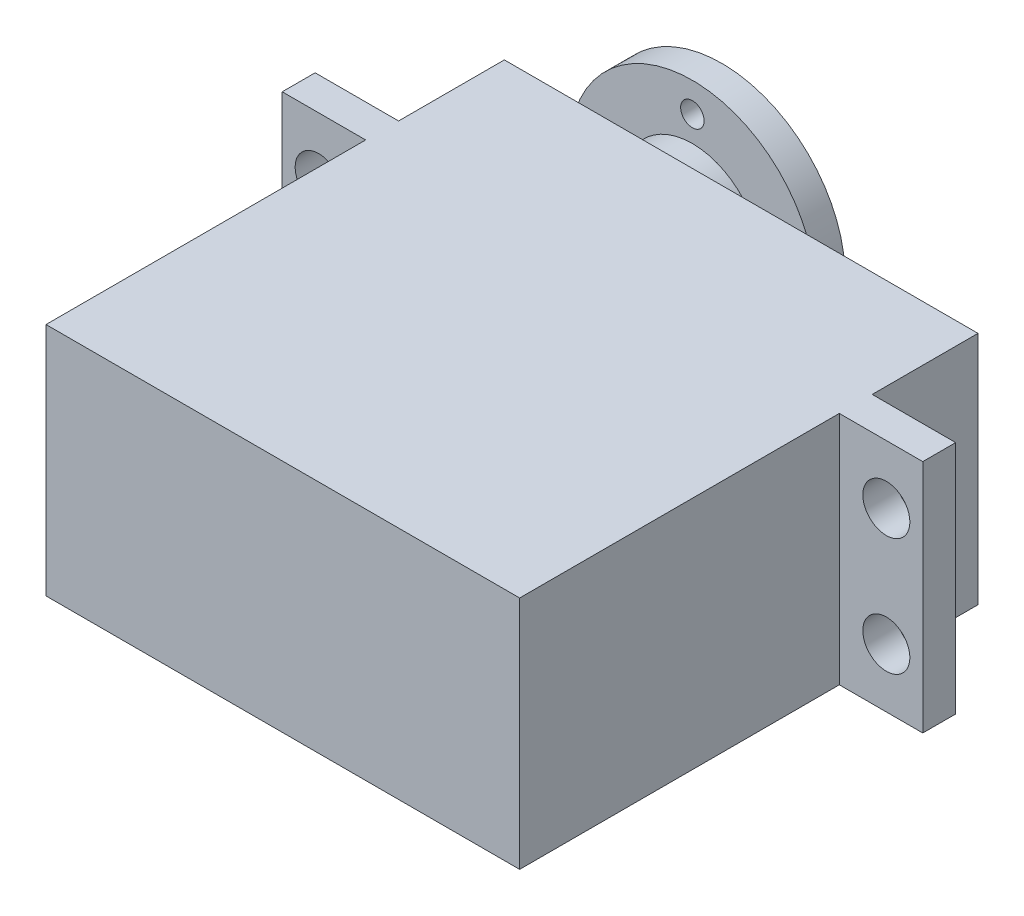
ISO-10303-21;
HEADER;
FILE_DESCRIPTION(('STEP AP214'),'2;1');
FILE_NAME('part.step','',(''),(''),'','','');
FILE_SCHEMA(('AUTOMOTIVE_DESIGN { 1 0 10303 214 1 1 1 1 }'));
ENDSEC;
DATA;
#1=APPLICATION_CONTEXT('core data for automotive mechanical design processes');
#2=APPLICATION_PROTOCOL_DEFINITION('international standard','automotive_design',2000,#1);
#3=PRODUCT_CONTEXT('',#1,'mechanical');
#4=PRODUCT('Part','Part','',(#3));
#5=PRODUCT_RELATED_PRODUCT_CATEGORY('part','',(#4));
#6=PRODUCT_DEFINITION_FORMATION('','',#4);
#7=PRODUCT_DEFINITION_CONTEXT('part definition',#1,'design');
#8=PRODUCT_DEFINITION('design','',#6,#7);
#9=PRODUCT_DEFINITION_SHAPE('','',#8);
#10=(LENGTH_UNIT() NAMED_UNIT(*) SI_UNIT(.MILLI.,.METRE.));
#11=(NAMED_UNIT(*) PLANE_ANGLE_UNIT() SI_UNIT($,.RADIAN.));
#12=(NAMED_UNIT(*) SI_UNIT($,.STERADIAN.) SOLID_ANGLE_UNIT());
#13=UNCERTAINTY_MEASURE_WITH_UNIT(LENGTH_MEASURE(1.E-05),#10,'distance_accuracy_value','');
#14=(GEOMETRIC_REPRESENTATION_CONTEXT(3) GLOBAL_UNCERTAINTY_ASSIGNED_CONTEXT((#13)) GLOBAL_UNIT_ASSIGNED_CONTEXT((#10,
#11,#12)) REPRESENTATION_CONTEXT('',''));
#15=CARTESIAN_POINT('',(0.,0.,0.));
#16=DIRECTION('',(0.,0.,1.));
#17=DIRECTION('',(1.,0.,0.));
#18=AXIS2_PLACEMENT_3D('',#15,#16,#17);
#19=CARTESIAN_POINT('',(-10.15,10.,-28.));
#20=DIRECTION('',(0.,0.,1.));
#21=DIRECTION('',(1.,0.,0.));
#22=AXIS2_PLACEMENT_3D('',#19,#20,#21);
#23=CYLINDRICAL_SURFACE('',#22,5.83746316110564);
#24=CARTESIAN_POINT('',(-10.15,10.,-19.5));
#25=DIRECTION('',(0.,0.,1.));
#26=DIRECTION('',(1.,0.,0.));
#27=AXIS2_PLACEMENT_3D('',#24,#25,#26);
#28=CIRCLE('',#27,5.83746316110564);
#29=CARTESIAN_POINT('',(-4.31253683889436,10.,-19.5));
#30=VERTEX_POINT('',#29);
#31=EDGE_CURVE('E41',#30,#30,#28,.F.);
#32=ORIENTED_EDGE('',*,*,#31,.T.);
#33=EDGE_LOOP('',(#32));
#34=FACE_BOUND('',#33,.T.);
#35=CARTESIAN_POINT('',(-10.15,10.,-25.5));
#36=DIRECTION('',(0.,0.,-1.));
#37=DIRECTION('',(-1.,0.,0.));
#38=AXIS2_PLACEMENT_3D('',#35,#36,#37);
#39=CIRCLE('',#38,5.83746316110564);
#40=CARTESIAN_POINT('',(-15.9874631611056,10.,-25.5));
#41=VERTEX_POINT('',#40);
#42=EDGE_CURVE('E11',#41,#41,#39,.T.);
#43=ORIENTED_EDGE('',*,*,#42,.F.);
#44=EDGE_LOOP('',(#43));
#45=FACE_BOUND('',#44,.T.);
#46=ADVANCED_FACE('F32',(#34,#45),#23,.T.);
#47=CARTESIAN_POINT('',(-20.15,20.,19.5));
#48=DIRECTION('',(1.,0.,0.));
#49=DIRECTION('',(0.,0.,-1.));
#50=AXIS2_PLACEMENT_3D('',#47,#48,#49);
#51=PLANE('',#50);
#52=DIRECTION('',(0.,0.,1.));
#53=VECTOR('',#52,1.);
#54=CARTESIAN_POINT('',(-20.15,0.,19.5));
#55=LINE('',#54,#53);
#56=CARTESIAN_POINT('',(-20.15,0.,-7.69999999999998));
#57=VERTEX_POINT('',#56);
#58=CARTESIAN_POINT('',(-20.15,0.,19.5));
#59=VERTEX_POINT('',#58);
#60=EDGE_CURVE('E154',#57,#59,#55,.T.);
#61=ORIENTED_EDGE('',*,*,#60,.T.);
#62=DIRECTION('',(0.,-1.,0.));
#63=VECTOR('',#62,1.);
#64=CARTESIAN_POINT('',(-20.15,20.,19.5));
#65=LINE('',#64,#63);
#66=CARTESIAN_POINT('',(-20.15,20.,19.5));
#67=VERTEX_POINT('',#66);
#68=EDGE_CURVE('E202',#67,#59,#65,.T.);
#69=ORIENTED_EDGE('',*,*,#68,.F.);
#70=DIRECTION('',(0.,0.,1.));
#71=VECTOR('',#70,1.);
#72=CARTESIAN_POINT('',(-20.15,20.,19.5));
#73=LINE('',#72,#71);
#74=CARTESIAN_POINT('',(-20.15,20.,-7.69999999999998));
#75=VERTEX_POINT('',#74);
#76=EDGE_CURVE('E177',#75,#67,#73,.T.);
#77=ORIENTED_EDGE('',*,*,#76,.F.);
#78=DIRECTION('',(0.,-1.,0.));
#79=VECTOR('',#78,1.);
#80=CARTESIAN_POINT('',(-20.15,20.,-7.69999999999998));
#81=LINE('',#80,#79);
#82=EDGE_CURVE('E150',#75,#57,#81,.T.);
#83=ORIENTED_EDGE('',*,*,#82,.T.);
#84=EDGE_LOOP('',(#61,#69,#77,#83));
#85=FACE_BOUND('',#84,.T.);
#86=ADVANCED_FACE('F34',(#85),#51,.F.);
#87=CARTESIAN_POINT('',(20.15,20.,19.5));
#88=DIRECTION('',(0.,0.,-1.));
#89=DIRECTION('',(-1.,0.,0.));
#90=AXIS2_PLACEMENT_3D('',#87,#88,#89);
#91=PLANE('',#90);
#92=DIRECTION('',(1.,0.,0.));
#93=VECTOR('',#92,1.);
#94=CARTESIAN_POINT('',(20.15,0.,19.5));
#95=LINE('',#94,#93);
#96=CARTESIAN_POINT('',(20.15,0.,19.5));
#97=VERTEX_POINT('',#96);
#98=EDGE_CURVE('E157',#59,#97,#95,.T.);
#99=ORIENTED_EDGE('',*,*,#98,.T.);
#100=DIRECTION('',(0.,-1.,0.));
#101=VECTOR('',#100,1.);
#102=CARTESIAN_POINT('',(20.15,20.,19.5));
#103=LINE('',#102,#101);
#104=CARTESIAN_POINT('',(20.15,20.,19.5));
#105=VERTEX_POINT('',#104);
#106=EDGE_CURVE('E199',#105,#97,#103,.T.);
#107=ORIENTED_EDGE('',*,*,#106,.F.);
#108=DIRECTION('',(1.,0.,0.));
#109=VECTOR('',#108,1.);
#110=CARTESIAN_POINT('',(20.15,20.,19.5));
#111=LINE('',#110,#109);
#112=EDGE_CURVE('E105',#67,#105,#111,.T.);
#113=ORIENTED_EDGE('',*,*,#112,.F.);
#114=ORIENTED_EDGE('',*,*,#68,.T.);
#115=EDGE_LOOP('',(#99,#107,#113,#114));
#116=FACE_BOUND('',#115,.T.);
#117=ADVANCED_FACE('F274',(#116),#91,.F.);
#118=CARTESIAN_POINT('',(20.15,20.,19.5));
#119=DIRECTION('',(-1.,0.,0.));
#120=DIRECTION('',(0.,0.,1.));
#121=AXIS2_PLACEMENT_3D('',#118,#119,#120);
#122=PLANE('',#121);
#123=DIRECTION('',(0.,0.,-1.));
#124=VECTOR('',#123,1.);
#125=CARTESIAN_POINT('',(20.15,0.,19.5));
#126=LINE('',#125,#124);
#127=CARTESIAN_POINT('',(20.15,0.,-7.7));
#128=VERTEX_POINT('',#127);
#129=EDGE_CURVE('E160',#97,#128,#126,.T.);
#130=ORIENTED_EDGE('',*,*,#129,.T.);
#131=DIRECTION('',(0.,-1.,0.));
#132=VECTOR('',#131,1.);
#133=CARTESIAN_POINT('',(20.15,20.,-7.7));
#134=LINE('',#133,#132);
#135=CARTESIAN_POINT('',(20.15,20.,-7.7));
#136=VERTEX_POINT('',#135);
#137=EDGE_CURVE('E196',#136,#128,#134,.T.);
#138=ORIENTED_EDGE('',*,*,#137,.F.);
#139=DIRECTION('',(0.,0.,-1.));
#140=VECTOR('',#139,1.);
#141=CARTESIAN_POINT('',(20.15,20.,19.5));
#142=LINE('',#141,#140);
#143=EDGE_CURVE('E229',#105,#136,#142,.T.);
#144=ORIENTED_EDGE('',*,*,#143,.F.);
#145=ORIENTED_EDGE('',*,*,#106,.T.);
#146=EDGE_LOOP('',(#130,#138,#144,#145));
#147=FACE_BOUND('',#146,.T.);
#148=ADVANCED_FACE('F394',(#147),#122,.F.);
#149=CARTESIAN_POINT('',(20.15,20.,-7.7));
#150=DIRECTION('',(0.,0.,-1.));
#151=DIRECTION('',(-1.,0.,0.));
#152=AXIS2_PLACEMENT_3D('',#149,#150,#151);
#153=PLANE('',#152);
#154=CARTESIAN_POINT('',(24.15,5.,-7.7));
#155=DIRECTION('',(0.,0.,-1.));
#156=DIRECTION('',(-1.,0.,0.));
#157=AXIS2_PLACEMENT_3D('',#154,#155,#156);
#158=CIRCLE('',#157,2.);
#159=CARTESIAN_POINT('',(22.15,5.,-7.7));
#160=VERTEX_POINT('',#159);
#161=EDGE_CURVE('E211',#160,#160,#158,.T.);
#162=ORIENTED_EDGE('',*,*,#161,.T.);
#163=EDGE_LOOP('',(#162));
#164=FACE_BOUND('',#163,.T.);
#165=CARTESIAN_POINT('',(24.15,15.,-7.7));
#166=DIRECTION('',(0.,0.,-1.));
#167=DIRECTION('',(-1.,0.,0.));
#168=AXIS2_PLACEMENT_3D('',#165,#166,#167);
#169=CIRCLE('',#168,2.);
#170=CARTESIAN_POINT('',(22.15,15.,-7.7));
#171=VERTEX_POINT('',#170);
#172=EDGE_CURVE('E158',#171,#171,#169,.T.);
#173=ORIENTED_EDGE('',*,*,#172,.T.);
#174=EDGE_LOOP('',(#173));
#175=FACE_BOUND('',#174,.T.);
#176=DIRECTION('',(1.,0.,0.));
#177=VECTOR('',#176,1.);
#178=CARTESIAN_POINT('',(20.15,0.,-7.7));
#179=LINE('',#178,#177);
#180=CARTESIAN_POINT('',(27.25,0.,-7.70000000000001));
#181=VERTEX_POINT('',#180);
#182=EDGE_CURVE('E162',#128,#181,#179,.T.);
#183=ORIENTED_EDGE('',*,*,#182,.T.);
#184=DIRECTION('',(0.,-1.,0.));
#185=VECTOR('',#184,1.);
#186=CARTESIAN_POINT('',(27.25,20.,-7.70000000000001));
#187=LINE('',#186,#185);
#188=CARTESIAN_POINT('',(27.25,20.,-7.70000000000001));
#189=VERTEX_POINT('',#188);
#190=EDGE_CURVE('E193',#189,#181,#187,.T.);
#191=ORIENTED_EDGE('',*,*,#190,.F.);
#192=DIRECTION('',(1.,0.,0.));
#193=VECTOR('',#192,1.);
#194=CARTESIAN_POINT('',(20.15,20.,-7.7));
#195=LINE('',#194,#193);
#196=EDGE_CURVE('E231',#136,#189,#195,.T.);
#197=ORIENTED_EDGE('',*,*,#196,.F.);
#198=ORIENTED_EDGE('',*,*,#137,.T.);
#199=EDGE_LOOP('',(#183,#191,#197,#198));
#200=FACE_BOUND('',#199,.T.);
#201=ADVANCED_FACE('F390',(#164,#175,#200),#153,.F.);
#202=CARTESIAN_POINT('',(27.25,20.,-10.5));
#203=DIRECTION('',(-1.,0.,0.));
#204=DIRECTION('',(0.,0.,1.));
#205=AXIS2_PLACEMENT_3D('',#202,#203,#204);
#206=PLANE('',#205);
#207=DIRECTION('',(0.,0.,-1.));
#208=VECTOR('',#207,1.);
#209=CARTESIAN_POINT('',(27.25,0.,-10.5));
#210=LINE('',#209,#208);
#211=CARTESIAN_POINT('',(27.25,0.,-10.5));
#212=VERTEX_POINT('',#211);
#213=EDGE_CURVE('E164',#181,#212,#210,.T.);
#214=ORIENTED_EDGE('',*,*,#213,.T.);
#215=DIRECTION('',(0.,-1.,0.));
#216=VECTOR('',#215,1.);
#217=CARTESIAN_POINT('',(27.25,20.,-10.5));
#218=LINE('',#217,#216);
#219=CARTESIAN_POINT('',(27.25,20.,-10.5));
#220=VERTEX_POINT('',#219);
#221=EDGE_CURVE('E190',#220,#212,#218,.T.);
#222=ORIENTED_EDGE('',*,*,#221,.F.);
#223=DIRECTION('',(0.,0.,-1.));
#224=VECTOR('',#223,1.);
#225=CARTESIAN_POINT('',(27.25,20.,-10.5));
#226=LINE('',#225,#224);
#227=EDGE_CURVE('E233',#189,#220,#226,.T.);
#228=ORIENTED_EDGE('',*,*,#227,.F.);
#229=ORIENTED_EDGE('',*,*,#190,.T.);
#230=EDGE_LOOP('',(#214,#222,#228,#229));
#231=FACE_BOUND('',#230,.T.);
#232=ADVANCED_FACE('F386',(#231),#206,.F.);
#233=CARTESIAN_POINT('',(20.15,20.,-10.5));
#234=DIRECTION('',(0.,0.,1.));
#235=DIRECTION('',(1.,0.,0.));
#236=AXIS2_PLACEMENT_3D('',#233,#234,#235);
#237=PLANE('',#236);
#238=CARTESIAN_POINT('',(24.15,5.,-10.5));
#239=DIRECTION('',(0.,0.,-1.));
#240=DIRECTION('',(1.,0.,0.));
#241=AXIS2_PLACEMENT_3D('',#238,#239,#240);
#242=CIRCLE('',#241,2.);
#243=CARTESIAN_POINT('',(26.15,5.,-10.5));
#244=VERTEX_POINT('',#243);
#245=EDGE_CURVE('E209',#244,#244,#242,.T.);
#246=ORIENTED_EDGE('',*,*,#245,.F.);
#247=EDGE_LOOP('',(#246));
#248=FACE_BOUND('',#247,.T.);
#249=CARTESIAN_POINT('',(24.15,15.,-10.5));
#250=DIRECTION('',(0.,0.,-1.));
#251=DIRECTION('',(-1.,0.,0.));
#252=AXIS2_PLACEMENT_3D('',#249,#250,#251);
#253=CIRCLE('',#252,2.);
#254=CARTESIAN_POINT('',(22.15,15.,-10.5));
#255=VERTEX_POINT('',#254);
#256=EDGE_CURVE('E215',#255,#255,#253,.T.);
#257=ORIENTED_EDGE('',*,*,#256,.F.);
#258=EDGE_LOOP('',(#257));
#259=FACE_BOUND('',#258,.T.);
#260=DIRECTION('',(-1.,0.,0.));
#261=VECTOR('',#260,1.);
#262=CARTESIAN_POINT('',(20.15,0.,-10.5));
#263=LINE('',#262,#261);
#264=CARTESIAN_POINT('',(20.15,0.,-10.5));
#265=VERTEX_POINT('',#264);
#266=EDGE_CURVE('E166',#212,#265,#263,.T.);
#267=ORIENTED_EDGE('',*,*,#266,.T.);
#268=DIRECTION('',(0.,-1.,0.));
#269=VECTOR('',#268,1.);
#270=CARTESIAN_POINT('',(20.15,20.,-10.5));
#271=LINE('',#270,#269);
#272=CARTESIAN_POINT('',(20.15,20.,-10.5));
#273=VERTEX_POINT('',#272);
#274=EDGE_CURVE('E187',#273,#265,#271,.T.);
#275=ORIENTED_EDGE('',*,*,#274,.F.);
#276=DIRECTION('',(-1.,0.,0.));
#277=VECTOR('',#276,1.);
#278=CARTESIAN_POINT('',(20.15,20.,-10.5));
#279=LINE('',#278,#277);
#280=EDGE_CURVE('E235',#220,#273,#279,.T.);
#281=ORIENTED_EDGE('',*,*,#280,.F.);
#282=ORIENTED_EDGE('',*,*,#221,.T.);
#283=EDGE_LOOP('',(#267,#275,#281,#282));
#284=FACE_BOUND('',#283,.T.);
#285=ADVANCED_FACE('F382',(#248,#259,#284),#237,.F.);
#286=CARTESIAN_POINT('',(20.15,20.,-10.5));
#287=DIRECTION('',(-1.,0.,0.));
#288=DIRECTION('',(0.,0.,1.));
#289=AXIS2_PLACEMENT_3D('',#286,#287,#288);
#290=PLANE('',#289);
#291=DIRECTION('',(0.,0.,-1.));
#292=VECTOR('',#291,1.);
#293=CARTESIAN_POINT('',(20.15,0.,-10.5));
#294=LINE('',#293,#292);
#295=CARTESIAN_POINT('',(20.15,0.,-19.5));
#296=VERTEX_POINT('',#295);
#297=EDGE_CURVE('E168',#265,#296,#294,.T.);
#298=ORIENTED_EDGE('',*,*,#297,.T.);
#299=DIRECTION('',(0.,-1.,0.));
#300=VECTOR('',#299,1.);
#301=CARTESIAN_POINT('',(20.15,20.,-19.5));
#302=LINE('',#301,#300);
#303=CARTESIAN_POINT('',(20.15,20.,-19.5));
#304=VERTEX_POINT('',#303);
#305=EDGE_CURVE('E184',#304,#296,#302,.T.);
#306=ORIENTED_EDGE('',*,*,#305,.F.);
#307=DIRECTION('',(0.,0.,-1.));
#308=VECTOR('',#307,1.);
#309=CARTESIAN_POINT('',(20.15,20.,-10.5));
#310=LINE('',#309,#308);
#311=EDGE_CURVE('E237',#273,#304,#310,.T.);
#312=ORIENTED_EDGE('',*,*,#311,.F.);
#313=ORIENTED_EDGE('',*,*,#274,.T.);
#314=EDGE_LOOP('',(#298,#306,#312,#313));
#315=FACE_BOUND('',#314,.T.);
#316=ADVANCED_FACE('F378',(#315),#290,.F.);
#317=CARTESIAN_POINT('',(20.15,20.,-19.5));
#318=DIRECTION('',(0.,0.,1.));
#319=DIRECTION('',(1.,0.,0.));
#320=AXIS2_PLACEMENT_3D('',#317,#318,#319);
#321=PLANE('',#320);
#322=ORIENTED_EDGE('',*,*,#31,.F.);
#323=EDGE_LOOP('',(#322));
#324=FACE_BOUND('',#323,.T.);
#325=DIRECTION('',(-1.,0.,0.));
#326=VECTOR('',#325,1.);
#327=CARTESIAN_POINT('',(20.15,0.,-19.5));
#328=LINE('',#327,#326);
#329=CARTESIAN_POINT('',(-20.15,0.,-19.5));
#330=VERTEX_POINT('',#329);
#331=EDGE_CURVE('E170',#296,#330,#328,.T.);
#332=ORIENTED_EDGE('',*,*,#331,.T.);
#333=DIRECTION('',(0.,-1.,0.));
#334=VECTOR('',#333,1.);
#335=CARTESIAN_POINT('',(-20.15,20.,-19.5));
#336=LINE('',#335,#334);
#337=CARTESIAN_POINT('',(-20.15,20.,-19.5));
#338=VERTEX_POINT('',#337);
#339=EDGE_CURVE('E181',#338,#330,#336,.T.);
#340=ORIENTED_EDGE('',*,*,#339,.F.);
#341=DIRECTION('',(-1.,0.,0.));
#342=VECTOR('',#341,1.);
#343=CARTESIAN_POINT('',(20.15,20.,-19.5));
#344=LINE('',#343,#342);
#345=EDGE_CURVE('E239',#304,#338,#344,.T.);
#346=ORIENTED_EDGE('',*,*,#345,.F.);
#347=ORIENTED_EDGE('',*,*,#305,.T.);
#348=EDGE_LOOP('',(#332,#340,#346,#347));
#349=FACE_BOUND('',#348,.T.);
#350=ADVANCED_FACE('F245',(#324,#349),#321,.F.);
#351=CARTESIAN_POINT('',(-20.15,20.,-10.5));
#352=DIRECTION('',(1.,0.,0.));
#353=DIRECTION('',(0.,0.,-1.));
#354=AXIS2_PLACEMENT_3D('',#351,#352,#353);
#355=PLANE('',#354);
#356=DIRECTION('',(0.,0.,1.));
#357=VECTOR('',#356,1.);
#358=CARTESIAN_POINT('',(-20.15,0.,-10.5));
#359=LINE('',#358,#357);
#360=CARTESIAN_POINT('',(-20.15,0.,-10.5));
#361=VERTEX_POINT('',#360);
#362=EDGE_CURVE('E172',#330,#361,#359,.T.);
#363=ORIENTED_EDGE('',*,*,#362,.T.);
#364=DIRECTION('',(0.,-1.,0.));
#365=VECTOR('',#364,1.);
#366=CARTESIAN_POINT('',(-20.15,20.,-10.5));
#367=LINE('',#366,#365);
#368=CARTESIAN_POINT('',(-20.15,20.,-10.5));
#369=VERTEX_POINT('',#368);
#370=EDGE_CURVE('E145',#369,#361,#367,.T.);
#371=ORIENTED_EDGE('',*,*,#370,.F.);
#372=DIRECTION('',(0.,0.,1.));
#373=VECTOR('',#372,1.);
#374=CARTESIAN_POINT('',(-20.15,20.,-10.5));
#375=LINE('',#374,#373);
#376=EDGE_CURVE('E136',#338,#369,#375,.T.);
#377=ORIENTED_EDGE('',*,*,#376,.F.);
#378=ORIENTED_EDGE('',*,*,#339,.T.);
#379=EDGE_LOOP('',(#363,#371,#377,#378));
#380=FACE_BOUND('',#379,.T.);
#381=ADVANCED_FACE('F249',(#380),#355,.F.);
#382=CARTESIAN_POINT('',(-20.15,20.,-10.5));
#383=DIRECTION('',(0.,0.,1.));
#384=DIRECTION('',(1.,0.,0.));
#385=AXIS2_PLACEMENT_3D('',#382,#383,#384);
#386=PLANE('',#385);
#387=CARTESIAN_POINT('',(-24.15,5.,-10.5));
#388=DIRECTION('',(0.,0.,-1.));
#389=DIRECTION('',(-1.,0.,0.));
#390=AXIS2_PLACEMENT_3D('',#387,#388,#389);
#391=CIRCLE('',#390,2.);
#392=CARTESIAN_POINT('',(-26.15,5.,-10.5));
#393=VERTEX_POINT('',#392);
#394=EDGE_CURVE('E361',#393,#393,#391,.T.);
#395=ORIENTED_EDGE('',*,*,#394,.F.);
#396=EDGE_LOOP('',(#395));
#397=FACE_BOUND('',#396,.T.);
#398=CARTESIAN_POINT('',(-24.15,15.,-10.5));
#399=DIRECTION('',(0.,0.,-1.));
#400=DIRECTION('',(1.,0.,0.));
#401=AXIS2_PLACEMENT_3D('',#398,#399,#400);
#402=CIRCLE('',#401,2.);
#403=CARTESIAN_POINT('',(-22.15,15.,-10.5));
#404=VERTEX_POINT('',#403);
#405=EDGE_CURVE('E222',#404,#404,#402,.T.);
#406=ORIENTED_EDGE('',*,*,#405,.F.);
#407=EDGE_LOOP('',(#406));
#408=FACE_BOUND('',#407,.T.);
#409=DIRECTION('',(-1.,0.,0.));
#410=VECTOR('',#409,1.);
#411=CARTESIAN_POINT('',(-20.15,0.,-10.5));
#412=LINE('',#411,#410);
#413=CARTESIAN_POINT('',(-27.25,0.,-10.5));
#414=VERTEX_POINT('',#413);
#415=EDGE_CURVE('E144',#361,#414,#412,.T.);
#416=ORIENTED_EDGE('',*,*,#415,.T.);
#417=DIRECTION('',(0.,-1.,0.));
#418=VECTOR('',#417,1.);
#419=CARTESIAN_POINT('',(-27.25,20.,-10.5));
#420=LINE('',#419,#418);
#421=CARTESIAN_POINT('',(-27.25,20.,-10.5));
#422=VERTEX_POINT('',#421);
#423=EDGE_CURVE('E141',#422,#414,#420,.T.);
#424=ORIENTED_EDGE('',*,*,#423,.F.);
#425=DIRECTION('',(-1.,0.,0.));
#426=VECTOR('',#425,1.);
#427=CARTESIAN_POINT('',(-20.15,20.,-10.5));
#428=LINE('',#427,#426);
#429=EDGE_CURVE('E130',#369,#422,#428,.T.);
#430=ORIENTED_EDGE('',*,*,#429,.F.);
#431=ORIENTED_EDGE('',*,*,#370,.T.);
#432=EDGE_LOOP('',(#416,#424,#430,#431));
#433=FACE_BOUND('',#432,.T.);
#434=ADVANCED_FACE('F142',(#397,#408,#433),#386,.F.);
#435=CARTESIAN_POINT('',(-27.25,20.,-10.5));
#436=DIRECTION('',(1.,0.,0.));
#437=DIRECTION('',(0.,0.,-1.));
#438=AXIS2_PLACEMENT_3D('',#435,#436,#437);
#439=PLANE('',#438);
#440=DIRECTION('',(0.,0.,1.));
#441=VECTOR('',#440,1.);
#442=CARTESIAN_POINT('',(-27.25,0.,-10.5));
#443=LINE('',#442,#441);
#444=CARTESIAN_POINT('',(-27.25,0.,-7.69999999999998));
#445=VERTEX_POINT('',#444);
#446=EDGE_CURVE('E90',#414,#445,#443,.T.);
#447=ORIENTED_EDGE('',*,*,#446,.T.);
#448=DIRECTION('',(0.,-1.,0.));
#449=VECTOR('',#448,1.);
#450=CARTESIAN_POINT('',(-27.25,20.,-7.69999999999998));
#451=LINE('',#450,#449);
#452=CARTESIAN_POINT('',(-27.25,20.,-7.69999999999998));
#453=VERTEX_POINT('',#452);
#454=EDGE_CURVE('E146',#453,#445,#451,.T.);
#455=ORIENTED_EDGE('',*,*,#454,.F.);
#456=DIRECTION('',(0.,0.,1.));
#457=VECTOR('',#456,1.);
#458=CARTESIAN_POINT('',(-27.25,20.,-10.5));
#459=LINE('',#458,#457);
#460=EDGE_CURVE('E134',#422,#453,#459,.T.);
#461=ORIENTED_EDGE('',*,*,#460,.F.);
#462=ORIENTED_EDGE('',*,*,#423,.T.);
#463=EDGE_LOOP('',(#447,#455,#461,#462));
#464=FACE_BOUND('',#463,.T.);
#465=ADVANCED_FACE('F148',(#464),#439,.F.);
#466=CARTESIAN_POINT('',(-20.15,20.,-7.69999999999998));
#467=DIRECTION('',(0.,0.,-1.));
#468=DIRECTION('',(-1.,0.,0.));
#469=AXIS2_PLACEMENT_3D('',#466,#467,#468);
#470=PLANE('',#469);
#471=CARTESIAN_POINT('',(-24.15,5.,-7.69999999999998));
#472=DIRECTION('',(0.,0.,-1.));
#473=DIRECTION('',(-1.,0.,0.));
#474=AXIS2_PLACEMENT_3D('',#471,#472,#473);
#475=CIRCLE('',#474,2.);
#476=CARTESIAN_POINT('',(-26.15,5.,-7.69999999999998));
#477=VERTEX_POINT('',#476);
#478=EDGE_CURVE('E208',#477,#477,#475,.T.);
#479=ORIENTED_EDGE('',*,*,#478,.T.);
#480=EDGE_LOOP('',(#479));
#481=FACE_BOUND('',#480,.T.);
#482=CARTESIAN_POINT('',(-24.15,15.,-7.69999999999998));
#483=DIRECTION('',(0.,0.,-1.));
#484=DIRECTION('',(-1.,0.,0.));
#485=AXIS2_PLACEMENT_3D('',#482,#483,#484);
#486=CIRCLE('',#485,2.);
#487=CARTESIAN_POINT('',(-26.15,15.,-7.69999999999998));
#488=VERTEX_POINT('',#487);
#489=EDGE_CURVE('E206',#488,#488,#486,.T.);
#490=ORIENTED_EDGE('',*,*,#489,.T.);
#491=EDGE_LOOP('',(#490));
#492=FACE_BOUND('',#491,.T.);
#493=DIRECTION('',(1.,0.,0.));
#494=VECTOR('',#493,1.);
#495=CARTESIAN_POINT('',(-20.15,0.,-7.69999999999998));
#496=LINE('',#495,#494);
#497=EDGE_CURVE('E96',#445,#57,#496,.T.);
#498=ORIENTED_EDGE('',*,*,#497,.T.);
#499=ORIENTED_EDGE('',*,*,#82,.F.);
#500=DIRECTION('',(1.,0.,0.));
#501=VECTOR('',#500,1.);
#502=CARTESIAN_POINT('',(-20.15,20.,-7.69999999999998));
#503=LINE('',#502,#501);
#504=EDGE_CURVE('E49',#453,#75,#503,.T.);
#505=ORIENTED_EDGE('',*,*,#504,.F.);
#506=ORIENTED_EDGE('',*,*,#454,.T.);
#507=EDGE_LOOP('',(#498,#499,#505,#506));
#508=FACE_BOUND('',#507,.T.);
#509=ADVANCED_FACE('F257',(#481,#492,#508),#470,.F.);
#510=CARTESIAN_POINT('',(0.,20.,0.));
#511=DIRECTION('',(0.,1.,0.));
#512=DIRECTION('',(0.,0.,1.));
#513=AXIS2_PLACEMENT_3D('',#510,#511,#512);
#514=PLANE('',#513);
#515=ORIENTED_EDGE('',*,*,#76,.T.);
#516=ORIENTED_EDGE('',*,*,#112,.T.);
#517=ORIENTED_EDGE('',*,*,#143,.T.);
#518=ORIENTED_EDGE('',*,*,#196,.T.);
#519=ORIENTED_EDGE('',*,*,#227,.T.);
#520=ORIENTED_EDGE('',*,*,#280,.T.);
#521=ORIENTED_EDGE('',*,*,#311,.T.);
#522=ORIENTED_EDGE('',*,*,#345,.T.);
#523=ORIENTED_EDGE('',*,*,#376,.T.);
#524=ORIENTED_EDGE('',*,*,#429,.T.);
#525=ORIENTED_EDGE('',*,*,#460,.T.);
#526=ORIENTED_EDGE('',*,*,#504,.T.);
#527=EDGE_LOOP('',(#515,#516,#517,#518,#519,#520,#521,#522,#523,#524,#525,#526));
#528=FACE_BOUND('',#527,.T.);
#529=ADVANCED_FACE('F132',(#528),#514,.T.);
#530=CARTESIAN_POINT('',(0.,0.,0.));
#531=DIRECTION('',(0.,1.,0.));
#532=DIRECTION('',(0.,0.,1.));
#533=AXIS2_PLACEMENT_3D('',#530,#531,#532);
#534=PLANE('',#533);
#535=ORIENTED_EDGE('',*,*,#60,.F.);
#536=ORIENTED_EDGE('',*,*,#497,.F.);
#537=ORIENTED_EDGE('',*,*,#446,.F.);
#538=ORIENTED_EDGE('',*,*,#415,.F.);
#539=ORIENTED_EDGE('',*,*,#362,.F.);
#540=ORIENTED_EDGE('',*,*,#331,.F.);
#541=ORIENTED_EDGE('',*,*,#297,.F.);
#542=ORIENTED_EDGE('',*,*,#266,.F.);
#543=ORIENTED_EDGE('',*,*,#213,.F.);
#544=ORIENTED_EDGE('',*,*,#182,.F.);
#545=ORIENTED_EDGE('',*,*,#129,.F.);
#546=ORIENTED_EDGE('',*,*,#98,.F.);
#547=EDGE_LOOP('',(#535,#536,#537,#538,#539,#540,#541,#542,#543,#544,#545,#546));
#548=FACE_BOUND('',#547,.T.);
#549=ADVANCED_FACE('F252',(#548),#534,.F.);
#550=CARTESIAN_POINT('',(24.15,15.,-0.499999999999987));
#551=DIRECTION('',(0.,0.,-1.));
#552=DIRECTION('',(-1.,0.,0.));
#553=AXIS2_PLACEMENT_3D('',#550,#551,#552);
#554=CYLINDRICAL_SURFACE('',#553,2.);
#555=ORIENTED_EDGE('',*,*,#256,.T.);
#556=EDGE_LOOP('',(#555));
#557=FACE_BOUND('',#556,.T.);
#558=ORIENTED_EDGE('',*,*,#172,.F.);
#559=EDGE_LOOP('',(#558));
#560=FACE_BOUND('',#559,.T.);
#561=ADVANCED_FACE('F280',(#557,#560),#554,.F.);
#562=CARTESIAN_POINT('',(-24.15,15.,-0.5));
#563=DIRECTION('',(0.,0.,-1.));
#564=DIRECTION('',(-1.,0.,0.));
#565=AXIS2_PLACEMENT_3D('',#562,#563,#564);
#566=CYLINDRICAL_SURFACE('',#565,2.);
#567=ORIENTED_EDGE('',*,*,#405,.T.);
#568=EDGE_LOOP('',(#567));
#569=FACE_BOUND('',#568,.T.);
#570=ORIENTED_EDGE('',*,*,#489,.F.);
#571=EDGE_LOOP('',(#570));
#572=FACE_BOUND('',#571,.T.);
#573=ADVANCED_FACE('F284',(#569,#572),#566,.F.);
#574=CARTESIAN_POINT('',(-24.15,5.,-0.5));
#575=DIRECTION('',(0.,0.,-1.));
#576=DIRECTION('',(-1.,0.,0.));
#577=AXIS2_PLACEMENT_3D('',#574,#575,#576);
#578=CYLINDRICAL_SURFACE('',#577,2.);
#579=ORIENTED_EDGE('',*,*,#394,.T.);
#580=EDGE_LOOP('',(#579));
#581=FACE_BOUND('',#580,.T.);
#582=ORIENTED_EDGE('',*,*,#478,.F.);
#583=EDGE_LOOP('',(#582));
#584=FACE_BOUND('',#583,.T.);
#585=ADVANCED_FACE('F289',(#581,#584),#578,.F.);
#586=CARTESIAN_POINT('',(24.15,5.,-0.499999999999987));
#587=DIRECTION('',(0.,0.,-1.));
#588=DIRECTION('',(-1.,0.,0.));
#589=AXIS2_PLACEMENT_3D('',#586,#587,#588);
#590=CYLINDRICAL_SURFACE('',#589,2.);
#591=ORIENTED_EDGE('',*,*,#245,.T.);
#592=EDGE_LOOP('',(#591));
#593=FACE_BOUND('',#592,.T.);
#594=ORIENTED_EDGE('',*,*,#161,.F.);
#595=EDGE_LOOP('',(#594));
#596=FACE_BOUND('',#595,.T.);
#597=ADVANCED_FACE('F296',(#593,#596),#590,.F.);
#598=CARTESIAN_POINT('',(-10.15,10.,-25.5));
#599=DIRECTION('',(0.,0.,-1.));
#600=DIRECTION('',(-1.,0.,0.));
#601=AXIS2_PLACEMENT_3D('',#598,#599,#600);
#602=CYLINDRICAL_SURFACE('',#601,10.5);
#603=CARTESIAN_POINT('',(-10.15,10.,-25.5));
#604=DIRECTION('',(0.,0.,-1.));
#605=DIRECTION('',(-1.,0.,0.));
#606=AXIS2_PLACEMENT_3D('',#603,#604,#605);
#607=CIRCLE('',#606,10.5);
#608=CARTESIAN_POINT('',(-20.65,10.,-25.5));
#609=VERTEX_POINT('',#608);
#610=EDGE_CURVE('E355',#609,#609,#607,.T.);
#611=ORIENTED_EDGE('',*,*,#610,.T.);
#612=EDGE_LOOP('',(#611));
#613=FACE_BOUND('',#612,.T.);
#614=CARTESIAN_POINT('',(-10.15,10.,-28.));
#615=DIRECTION('',(0.,0.,-1.));
#616=DIRECTION('',(-1.,0.,0.));
#617=AXIS2_PLACEMENT_3D('',#614,#615,#616);
#618=CIRCLE('',#617,10.5);
#619=CARTESIAN_POINT('',(-20.65,10.,-28.));
#620=VERTEX_POINT('',#619);
#621=EDGE_CURVE('E354',#620,#620,#618,.T.);
#622=ORIENTED_EDGE('',*,*,#621,.F.);
#623=EDGE_LOOP('',(#622));
#624=FACE_BOUND('',#623,.T.);
#625=ADVANCED_FACE('F300',(#613,#624),#602,.T.);
#626=CARTESIAN_POINT('',(-10.15,10.,-25.5));
#627=DIRECTION('',(0.,0.,-1.));
#628=DIRECTION('',(-1.,0.,0.));
#629=AXIS2_PLACEMENT_3D('',#626,#627,#628);
#630=PLANE('',#629);
#631=CARTESIAN_POINT('',(-18.15,10.,-25.5));
#632=DIRECTION('',(0.,0.,-1.));
#633=DIRECTION('',(-1.,0.,0.));
#634=AXIS2_PLACEMENT_3D('',#631,#632,#633);
#635=CIRCLE('',#634,1.);
#636=CARTESIAN_POINT('',(-19.15,10.,-25.5));
#637=VERTEX_POINT('',#636);
#638=EDGE_CURVE('E332',#637,#637,#635,.F.);
#639=ORIENTED_EDGE('',*,*,#638,.F.);
#640=EDGE_LOOP('',(#639));
#641=FACE_BOUND('',#640,.T.);
#642=CARTESIAN_POINT('',(-2.15,10.,-25.5));
#643=DIRECTION('',(0.,0.,-1.));
#644=DIRECTION('',(-1.,0.,0.));
#645=AXIS2_PLACEMENT_3D('',#642,#643,#644);
#646=CIRCLE('',#645,1.);
#647=CARTESIAN_POINT('',(-3.15,10.,-25.5));
#648=VERTEX_POINT('',#647);
#649=EDGE_CURVE('E338',#648,#648,#646,.F.);
#650=ORIENTED_EDGE('',*,*,#649,.F.);
#651=EDGE_LOOP('',(#650));
#652=FACE_BOUND('',#651,.T.);
#653=CARTESIAN_POINT('',(-10.15,2.,-25.5));
#654=DIRECTION('',(0.,0.,-1.));
#655=DIRECTION('',(-1.,0.,0.));
#656=AXIS2_PLACEMENT_3D('',#653,#654,#655);
#657=CIRCLE('',#656,1.);
#658=CARTESIAN_POINT('',(-11.15,2.,-25.5));
#659=VERTEX_POINT('',#658);
#660=EDGE_CURVE('E344',#659,#659,#657,.F.);
#661=ORIENTED_EDGE('',*,*,#660,.F.);
#662=EDGE_LOOP('',(#661));
#663=FACE_BOUND('',#662,.T.);
#664=CARTESIAN_POINT('',(-10.15,18.,-25.5));
#665=DIRECTION('',(0.,0.,-1.));
#666=DIRECTION('',(-1.,0.,0.));
#667=AXIS2_PLACEMENT_3D('',#664,#665,#666);
#668=CIRCLE('',#667,1.);
#669=CARTESIAN_POINT('',(-11.15,18.,-25.5));
#670=VERTEX_POINT('',#669);
#671=EDGE_CURVE('E335',#670,#670,#668,.F.);
#672=ORIENTED_EDGE('',*,*,#671,.F.);
#673=EDGE_LOOP('',(#672));
#674=FACE_BOUND('',#673,.T.);
#675=ORIENTED_EDGE('',*,*,#42,.T.);
#676=EDGE_LOOP('',(#675));
#677=FACE_BOUND('',#676,.T.);
#678=ORIENTED_EDGE('',*,*,#610,.F.);
#679=EDGE_LOOP('',(#678));
#680=FACE_BOUND('',#679,.T.);
#681=ADVANCED_FACE('F304',(#641,#652,#663,#674,#677,#680),#630,.F.);
#682=CARTESIAN_POINT('',(-10.15,10.,-28.));
#683=DIRECTION('',(0.,0.,-1.));
#684=DIRECTION('',(-1.,0.,0.));
#685=AXIS2_PLACEMENT_3D('',#682,#683,#684);
#686=PLANE('',#685);
#687=CARTESIAN_POINT('',(-18.15,10.,-28.));
#688=DIRECTION('',(0.,0.,-1.));
#689=DIRECTION('',(-1.,0.,0.));
#690=AXIS2_PLACEMENT_3D('',#687,#688,#689);
#691=CIRCLE('',#690,1.);
#692=CARTESIAN_POINT('',(-19.15,10.,-28.));
#693=VERTEX_POINT('',#692);
#694=EDGE_CURVE('E329',#693,#693,#691,.T.);
#695=ORIENTED_EDGE('',*,*,#694,.F.);
#696=EDGE_LOOP('',(#695));
#697=FACE_BOUND('',#696,.T.);
#698=CARTESIAN_POINT('',(-2.15,10.,-28.));
#699=DIRECTION('',(0.,0.,-1.));
#700=DIRECTION('',(1.,0.,0.));
#701=AXIS2_PLACEMENT_3D('',#698,#699,#700);
#702=CIRCLE('',#701,1.);
#703=CARTESIAN_POINT('',(-1.15,10.,-28.));
#704=VERTEX_POINT('',#703);
#705=EDGE_CURVE('E333',#704,#704,#702,.T.);
#706=ORIENTED_EDGE('',*,*,#705,.F.);
#707=EDGE_LOOP('',(#706));
#708=FACE_BOUND('',#707,.T.);
#709=CARTESIAN_POINT('',(-10.15,2.,-28.));
#710=DIRECTION('',(0.,0.,-1.));
#711=DIRECTION('',(1.,0.,0.));
#712=AXIS2_PLACEMENT_3D('',#709,#710,#711);
#713=CIRCLE('',#712,1.);
#714=CARTESIAN_POINT('',(-9.15,2.,-28.));
#715=VERTEX_POINT('',#714);
#716=EDGE_CURVE('E342',#715,#715,#713,.T.);
#717=ORIENTED_EDGE('',*,*,#716,.F.);
#718=EDGE_LOOP('',(#717));
#719=FACE_BOUND('',#718,.T.);
#720=CARTESIAN_POINT('',(-10.15,18.,-28.));
#721=DIRECTION('',(0.,0.,-1.));
#722=DIRECTION('',(-1.,0.,0.));
#723=AXIS2_PLACEMENT_3D('',#720,#721,#722);
#724=CIRCLE('',#723,1.);
#725=CARTESIAN_POINT('',(-11.15,18.,-28.));
#726=VERTEX_POINT('',#725);
#727=EDGE_CURVE('E351',#726,#726,#724,.T.);
#728=ORIENTED_EDGE('',*,*,#727,.F.);
#729=EDGE_LOOP('',(#728));
#730=FACE_BOUND('',#729,.T.);
#731=ORIENTED_EDGE('',*,*,#621,.T.);
#732=EDGE_LOOP('',(#731));
#733=FACE_BOUND('',#732,.T.);
#734=ADVANCED_FACE('F277',(#697,#708,#719,#730,#733),#686,.T.);
#735=CARTESIAN_POINT('',(-10.15,18.,19.501));
#736=DIRECTION('',(0.,0.,-1.));
#737=DIRECTION('',(-1.,0.,0.));
#738=AXIS2_PLACEMENT_3D('',#735,#736,#737);
#739=CYLINDRICAL_SURFACE('',#738,1.);
#740=ORIENTED_EDGE('',*,*,#727,.T.);
#741=EDGE_LOOP('',(#740));
#742=FACE_BOUND('',#741,.T.);
#743=ORIENTED_EDGE('',*,*,#671,.T.);
#744=EDGE_LOOP('',(#743));
#745=FACE_BOUND('',#744,.T.);
#746=ADVANCED_FACE('F309',(#742,#745),#739,.F.);
#747=CARTESIAN_POINT('',(-10.15,2.,19.501));
#748=DIRECTION('',(0.,0.,-1.));
#749=DIRECTION('',(-1.,0.,0.));
#750=AXIS2_PLACEMENT_3D('',#747,#748,#749);
#751=CYLINDRICAL_SURFACE('',#750,1.);
#752=ORIENTED_EDGE('',*,*,#716,.T.);
#753=EDGE_LOOP('',(#752));
#754=FACE_BOUND('',#753,.T.);
#755=ORIENTED_EDGE('',*,*,#660,.T.);
#756=EDGE_LOOP('',(#755));
#757=FACE_BOUND('',#756,.T.);
#758=ADVANCED_FACE('F312',(#754,#757),#751,.F.);
#759=CARTESIAN_POINT('',(-2.15,10.,19.501));
#760=DIRECTION('',(0.,0.,-1.));
#761=DIRECTION('',(-1.,0.,0.));
#762=AXIS2_PLACEMENT_3D('',#759,#760,#761);
#763=CYLINDRICAL_SURFACE('',#762,1.);
#764=ORIENTED_EDGE('',*,*,#705,.T.);
#765=EDGE_LOOP('',(#764));
#766=FACE_BOUND('',#765,.T.);
#767=ORIENTED_EDGE('',*,*,#649,.T.);
#768=EDGE_LOOP('',(#767));
#769=FACE_BOUND('',#768,.T.);
#770=ADVANCED_FACE('F316',(#766,#769),#763,.F.);
#771=CARTESIAN_POINT('',(-18.15,10.,19.501));
#772=DIRECTION('',(0.,0.,-1.));
#773=DIRECTION('',(-1.,0.,0.));
#774=AXIS2_PLACEMENT_3D('',#771,#772,#773);
#775=CYLINDRICAL_SURFACE('',#774,1.);
#776=ORIENTED_EDGE('',*,*,#694,.T.);
#777=EDGE_LOOP('',(#776));
#778=FACE_BOUND('',#777,.T.);
#779=ORIENTED_EDGE('',*,*,#638,.T.);
#780=EDGE_LOOP('',(#779));
#781=FACE_BOUND('',#780,.T.);
#782=ADVANCED_FACE('F320',(#778,#781),#775,.F.);
#783=CLOSED_SHELL('',(#46,#86,#117,#148,#201,#232,#285,#316,#350,#381,#434,#465,#509,#529,#549,
#561,#573,#585,#597,#625,#681,#734,#746,#758,#770,#782));
#784=MANIFOLD_SOLID_BREP('B2',#783);
#785=ADVANCED_BREP_SHAPE_REPRESENTATION('',(#18,#784),#14);
#786=SHAPE_DEFINITION_REPRESENTATION(#9,#785);
ENDSEC;
END-ISO-10303-21;
